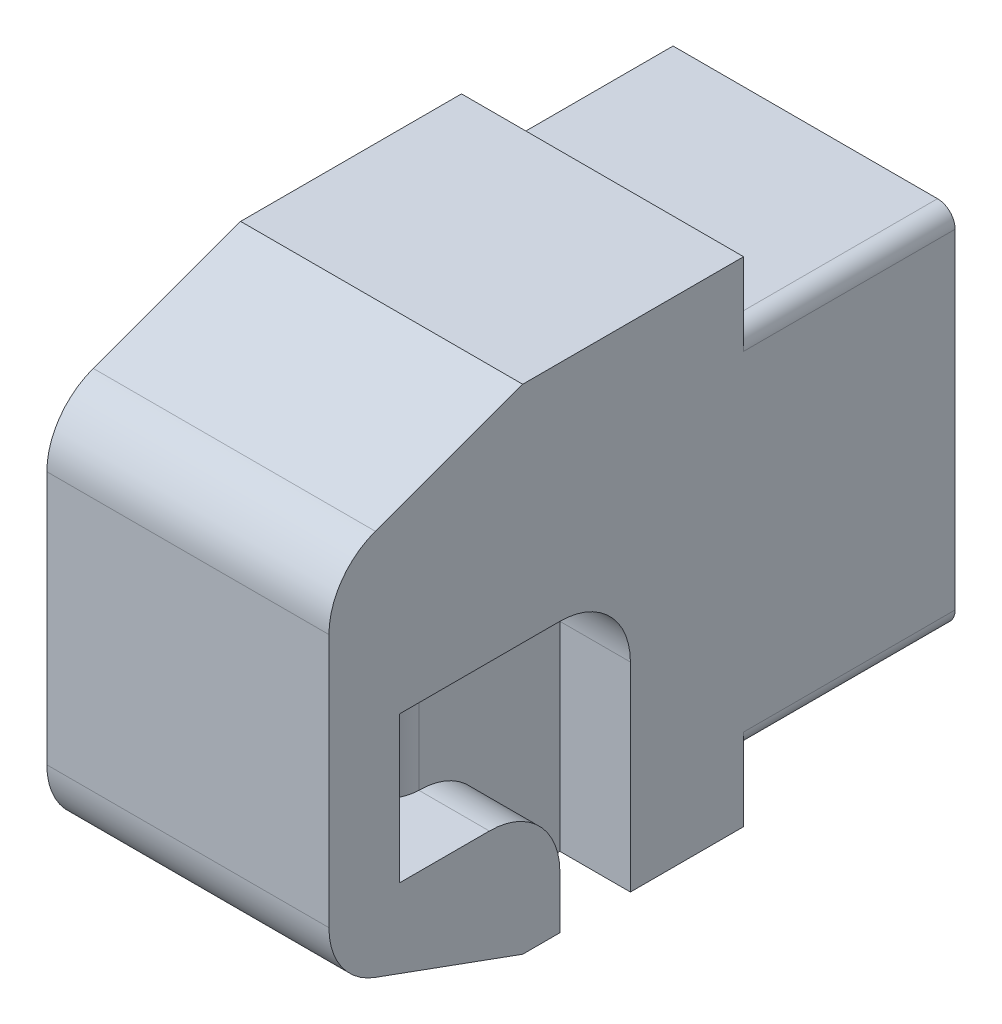
ISO-10303-21;
HEADER;
FILE_DESCRIPTION(('STEP AP214'),'2;1');
FILE_NAME('part.step','',(''),(''),'','','');
FILE_SCHEMA(('AUTOMOTIVE_DESIGN { 1 0 10303 214 1 1 1 1 }'));
ENDSEC;
DATA;
#1=APPLICATION_CONTEXT('core data for automotive mechanical design processes');
#2=APPLICATION_PROTOCOL_DEFINITION('international standard','automotive_design',2000,#1);
#3=PRODUCT_CONTEXT('',#1,'mechanical');
#4=PRODUCT('Part','Part','',(#3));
#5=PRODUCT_RELATED_PRODUCT_CATEGORY('part','',(#4));
#6=PRODUCT_DEFINITION_FORMATION('','',#4);
#7=PRODUCT_DEFINITION_CONTEXT('part definition',#1,'design');
#8=PRODUCT_DEFINITION('design','',#6,#7);
#9=PRODUCT_DEFINITION_SHAPE('','',#8);
#10=(LENGTH_UNIT() NAMED_UNIT(*) SI_UNIT(.MILLI.,.METRE.));
#11=(NAMED_UNIT(*) PLANE_ANGLE_UNIT() SI_UNIT($,.RADIAN.));
#12=(NAMED_UNIT(*) SI_UNIT($,.STERADIAN.) SOLID_ANGLE_UNIT());
#13=UNCERTAINTY_MEASURE_WITH_UNIT(LENGTH_MEASURE(1.E-05),#10,'distance_accuracy_value','');
#14=(GEOMETRIC_REPRESENTATION_CONTEXT(3) GLOBAL_UNCERTAINTY_ASSIGNED_CONTEXT((#13)) GLOBAL_UNIT_ASSIGNED_CONTEXT((#10,
#11,#12)) REPRESENTATION_CONTEXT('',''));
#15=CARTESIAN_POINT('',(0.,0.,0.));
#16=DIRECTION('',(0.,0.,1.));
#17=DIRECTION('',(1.,0.,0.));
#18=AXIS2_PLACEMENT_3D('',#15,#16,#17);
#19=CARTESIAN_POINT('',(0.,0.,6.));
#20=DIRECTION('',(1.,0.,0.));
#21=DIRECTION('',(0.,1.,0.));
#22=AXIS2_PLACEMENT_3D('',#19,#20,#21);
#23=PLANE('',#22);
#24=DIRECTION('',(0.,-1.,0.));
#25=VECTOR('',#24,1.);
#26=CARTESIAN_POINT('',(0.,-1.825,17.76));
#27=LINE('',#26,#25);
#28=CARTESIAN_POINT('',(0.,8.77458492358058,17.76));
#29=VERTEX_POINT('',#28);
#30=CARTESIAN_POINT('',(0.,1.57541507641942,17.76));
#31=VERTEX_POINT('',#30);
#32=EDGE_CURVE('E272',#29,#31,#27,.T.);
#33=ORIENTED_EDGE('',*,*,#32,.F.);
#34=CARTESIAN_POINT('',(0.,8.77458492358058,15.76));
#35=DIRECTION('',(1.,0.,0.));
#36=DIRECTION('',(0.,1.,0.));
#37=AXIS2_PLACEMENT_3D('',#34,#35,#36);
#38=CIRCLE('',#37,2.);
#39=CARTESIAN_POINT('',(0.,10.6539701651524,16.4440402866513));
#40=VERTEX_POINT('',#39);
#41=EDGE_CURVE('E340',#29,#40,#38,.F.);
#42=ORIENTED_EDGE('',*,*,#41,.T.);
#43=DIRECTION('',(0.,-0.342020143325669,0.939692620785908));
#44=VECTOR('',#43,1.);
#45=CARTESIAN_POINT('',(0.,10.175,17.76));
#46=LINE('',#45,#44);
#47=CARTESIAN_POINT('',(0.,12.175,12.2650451610908));
#48=VERTEX_POINT('',#47);
#49=EDGE_CURVE('E321',#40,#48,#46,.F.);
#50=ORIENTED_EDGE('',*,*,#49,.T.);
#51=DIRECTION('',(0.,0.,-1.));
#52=VECTOR('',#51,1.);
#53=CARTESIAN_POINT('',(0.,12.175,17.76));
#54=LINE('',#53,#52);
#55=CARTESIAN_POINT('',(0.,12.175,6.));
#56=VERTEX_POINT('',#55);
#57=EDGE_CURVE('E279',#48,#56,#54,.T.);
#58=ORIENTED_EDGE('',*,*,#57,.T.);
#59=DIRECTION('',(0.,-1.,0.));
#60=VECTOR('',#59,1.);
#61=CARTESIAN_POINT('',(0.,-1.825,6.));
#62=LINE('',#61,#60);
#63=CARTESIAN_POINT('',(0.,10.35,6.));
#64=VERTEX_POINT('',#63);
#65=EDGE_CURVE('E280',#56,#64,#62,.T.);
#66=ORIENTED_EDGE('',*,*,#65,.T.);
#67=DIRECTION('',(0.,0.,-1.));
#68=VECTOR('',#67,1.);
#69=CARTESIAN_POINT('',(0.,10.35,6.));
#70=LINE('',#69,#68);
#71=CARTESIAN_POINT('',(0.,10.35,0.));
#72=VERTEX_POINT('',#71);
#73=EDGE_CURVE('E304',#64,#72,#70,.T.);
#74=ORIENTED_EDGE('',*,*,#73,.T.);
#75=DIRECTION('',(0.,-1.,0.));
#76=VECTOR('',#75,1.);
#77=CARTESIAN_POINT('',(0.,0.,0.));
#78=LINE('',#77,#76);
#79=CARTESIAN_POINT('',(0.,0.,0.));
#80=VERTEX_POINT('',#79);
#81=EDGE_CURVE('E298',#72,#80,#78,.T.);
#82=ORIENTED_EDGE('',*,*,#81,.T.);
#83=DIRECTION('',(0.,0.,-1.));
#84=VECTOR('',#83,1.);
#85=CARTESIAN_POINT('',(0.,0.,6.));
#86=LINE('',#85,#84);
#87=CARTESIAN_POINT('',(0.,0.,6.));
#88=VERTEX_POINT('',#87);
#89=EDGE_CURVE('E315',#88,#80,#86,.T.);
#90=ORIENTED_EDGE('',*,*,#89,.F.);
#91=CARTESIAN_POINT('',(0.,-1.825,6.));
#92=VERTEX_POINT('',#91);
#93=EDGE_CURVE('E264',#88,#92,#62,.T.);
#94=ORIENTED_EDGE('',*,*,#93,.T.);
#95=DIRECTION('',(0.,0.,-1.));
#96=VECTOR('',#95,1.);
#97=CARTESIAN_POINT('',(0.,-1.825,17.76));
#98=LINE('',#97,#96);
#99=CARTESIAN_POINT('',(0.,-1.825,12.2650451610908));
#100=VERTEX_POINT('',#99);
#101=EDGE_CURVE('E296',#100,#92,#98,.T.);
#102=ORIENTED_EDGE('',*,*,#101,.F.);
#103=DIRECTION('',(0.,-0.342020143325669,-0.939692620785908));
#104=VECTOR('',#103,1.);
#105=CARTESIAN_POINT('',(0.,0.175000000000005,17.76));
#106=LINE('',#105,#104);
#107=CARTESIAN_POINT('',(0.,-0.303970165152393,16.4440402866513));
#108=VERTEX_POINT('',#107);
#109=EDGE_CURVE('E318',#100,#108,#106,.F.);
#110=ORIENTED_EDGE('',*,*,#109,.T.);
#111=CARTESIAN_POINT('',(0.,1.57541507641942,15.76));
#112=DIRECTION('',(1.,0.,0.));
#113=DIRECTION('',(0.,1.,0.));
#114=AXIS2_PLACEMENT_3D('',#111,#112,#113);
#115=CIRCLE('',#114,2.);
#116=EDGE_CURVE('E338',#108,#31,#115,.F.);
#117=ORIENTED_EDGE('',*,*,#116,.T.);
#118=EDGE_LOOP('',(#33,#42,#50,#58,#66,#74,#82,#90,#94,#102,#110,#117));
#119=FACE_BOUND('',#118,.T.);
#120=ADVANCED_FACE('F36',(#119),#23,.F.);
#121=CARTESIAN_POINT('',(0.,0.,6.));
#122=DIRECTION('',(0.,1.,0.));
#123=DIRECTION('',(0.,0.,1.));
#124=AXIS2_PLACEMENT_3D('',#121,#122,#123);
#125=PLANE('',#124);
#126=DIRECTION('',(1.,0.,0.));
#127=VECTOR('',#126,1.);
#128=CARTESIAN_POINT('',(0.,0.,0.));
#129=LINE('',#128,#127);
#130=CARTESIAN_POINT('',(7.5,0.,0.));
#131=VERTEX_POINT('',#130);
#132=EDGE_CURVE('E307',#80,#131,#129,.T.);
#133=ORIENTED_EDGE('',*,*,#132,.T.);
#134=DIRECTION('',(0.,0.,-1.));
#135=VECTOR('',#134,1.);
#136=CARTESIAN_POINT('',(7.5,0.,6.));
#137=LINE('',#136,#135);
#138=CARTESIAN_POINT('',(7.5,0.,6.));
#139=VERTEX_POINT('',#138);
#140=EDGE_CURVE('E51',#131,#139,#137,.F.);
#141=ORIENTED_EDGE('',*,*,#140,.T.);
#142=DIRECTION('',(1.,0.,0.));
#143=VECTOR('',#142,1.);
#144=CARTESIAN_POINT('',(0.,0.,6.));
#145=LINE('',#144,#143);
#146=EDGE_CURVE('E299',#88,#139,#145,.T.);
#147=ORIENTED_EDGE('',*,*,#146,.F.);
#148=ORIENTED_EDGE('',*,*,#89,.T.);
#149=EDGE_LOOP('',(#133,#141,#147,#148));
#150=FACE_BOUND('',#149,.T.);
#151=ADVANCED_FACE('F409',(#150),#125,.F.);
#152=CARTESIAN_POINT('',(8.,0.,6.));
#153=DIRECTION('',(-1.,0.,0.));
#154=DIRECTION('',(0.,-1.,0.));
#155=AXIS2_PLACEMENT_3D('',#152,#153,#154);
#156=PLANE('',#155);
#157=DIRECTION('',(0.,1.,0.));
#158=VECTOR('',#157,1.);
#159=CARTESIAN_POINT('',(8.,0.,0.));
#160=LINE('',#159,#158);
#161=CARTESIAN_POINT('',(8.,0.5,0.));
#162=VERTEX_POINT('',#161);
#163=CARTESIAN_POINT('',(8.,9.85,0.));
#164=VERTEX_POINT('',#163);
#165=EDGE_CURVE('E309',#162,#164,#160,.T.);
#166=ORIENTED_EDGE('',*,*,#165,.T.);
#167=DIRECTION('',(0.,0.,-1.));
#168=VECTOR('',#167,1.);
#169=CARTESIAN_POINT('',(8.,9.85,6.));
#170=LINE('',#169,#168);
#171=CARTESIAN_POINT('',(8.,9.85,6.));
#172=VERTEX_POINT('',#171);
#173=EDGE_CURVE('E385',#164,#172,#170,.F.);
#174=ORIENTED_EDGE('',*,*,#173,.T.);
#175=DIRECTION('',(0.,1.,0.));
#176=VECTOR('',#175,1.);
#177=CARTESIAN_POINT('',(8.,-1.825,6.));
#178=LINE('',#177,#176);
#179=CARTESIAN_POINT('',(8.,12.175,6.));
#180=VERTEX_POINT('',#179);
#181=EDGE_CURVE('E59',#172,#180,#178,.T.);
#182=ORIENTED_EDGE('',*,*,#181,.T.);
#183=DIRECTION('',(0.,0.,-1.));
#184=VECTOR('',#183,1.);
#185=CARTESIAN_POINT('',(8.,12.175,17.76));
#186=LINE('',#185,#184);
#187=CARTESIAN_POINT('',(8.,12.175,12.2650451610908));
#188=VERTEX_POINT('',#187);
#189=EDGE_CURVE('E291',#188,#180,#186,.T.);
#190=ORIENTED_EDGE('',*,*,#189,.F.);
#191=DIRECTION('',(0.,0.342020143325669,-0.939692620785908));
#192=VECTOR('',#191,1.);
#193=CARTESIAN_POINT('',(8.,10.175,17.76));
#194=LINE('',#193,#192);
#195=CARTESIAN_POINT('',(8.,10.6539701651524,16.4440402866513));
#196=VERTEX_POINT('',#195);
#197=EDGE_CURVE('E327',#188,#196,#194,.F.);
#198=ORIENTED_EDGE('',*,*,#197,.T.);
#199=CARTESIAN_POINT('',(8.,8.77458492358058,15.76));
#200=DIRECTION('',(-1.,0.,0.));
#201=DIRECTION('',(0.,-1.,0.));
#202=AXIS2_PLACEMENT_3D('',#199,#200,#201);
#203=CIRCLE('',#202,2.);
#204=CARTESIAN_POINT('',(8.,8.77458492358057,17.76));
#205=VERTEX_POINT('',#204);
#206=EDGE_CURVE('E346',#196,#205,#203,.F.);
#207=ORIENTED_EDGE('',*,*,#206,.T.);
#208=DIRECTION('',(0.,1.,0.));
#209=VECTOR('',#208,1.);
#210=CARTESIAN_POINT('',(8.,-1.825,17.76));
#211=LINE('',#210,#209);
#212=CARTESIAN_POINT('',(8.,1.57541507641942,17.76));
#213=VERTEX_POINT('',#212);
#214=EDGE_CURVE('E275',#213,#205,#211,.T.);
#215=ORIENTED_EDGE('',*,*,#214,.F.);
#216=CARTESIAN_POINT('',(8.,1.57541507641942,15.76));
#217=DIRECTION('',(-1.,0.,0.));
#218=DIRECTION('',(0.,-1.,0.));
#219=AXIS2_PLACEMENT_3D('',#216,#217,#218);
#220=CIRCLE('',#219,2.);
#221=CARTESIAN_POINT('',(8.,-0.303970165152394,16.4440402866513));
#222=VERTEX_POINT('',#221);
#223=EDGE_CURVE('E344',#213,#222,#220,.F.);
#224=ORIENTED_EDGE('',*,*,#223,.T.);
#225=DIRECTION('',(0.,0.342020143325669,0.939692620785908));
#226=VECTOR('',#225,1.);
#227=CARTESIAN_POINT('',(8.,0.175000000000005,17.76));
#228=LINE('',#227,#226);
#229=CARTESIAN_POINT('',(8.,-1.825,12.2650451610908));
#230=VERTEX_POINT('',#229);
#231=EDGE_CURVE('E325',#222,#230,#228,.F.);
#232=ORIENTED_EDGE('',*,*,#231,.T.);
#233=DIRECTION('',(0.,0.,-1.));
#234=VECTOR('',#233,1.);
#235=CARTESIAN_POINT('',(8.,-1.825,17.76));
#236=LINE('',#235,#234);
#237=CARTESIAN_POINT('',(8.,-1.825,11.21));
#238=VERTEX_POINT('',#237);
#239=EDGE_CURVE('E294',#230,#238,#236,.T.);
#240=ORIENTED_EDGE('',*,*,#239,.T.);
#241=DIRECTION('',(0.,-1.,0.));
#242=VECTOR('',#241,1.);
#243=CARTESIAN_POINT('',(8.,-1.825,11.21));
#244=LINE('',#243,#242);
#245=CARTESIAN_POINT('',(8.,-0.324999999999999,11.21));
#246=VERTEX_POINT('',#245);
#247=EDGE_CURVE('E222',#246,#238,#244,.T.);
#248=ORIENTED_EDGE('',*,*,#247,.F.);
#249=CARTESIAN_POINT('',(8.,-0.324999999999999,13.21));
#250=DIRECTION('',(-1.,0.,0.));
#251=DIRECTION('',(0.,-1.,0.));
#252=AXIS2_PLACEMENT_3D('',#249,#250,#251);
#253=CIRCLE('',#252,2.);
#254=CARTESIAN_POINT('',(8.,1.675,13.21));
#255=VERTEX_POINT('',#254);
#256=EDGE_CURVE('E359',#246,#255,#253,.F.);
#257=ORIENTED_EDGE('',*,*,#256,.T.);
#258=DIRECTION('',(0.,0.,-1.));
#259=VECTOR('',#258,1.);
#260=CARTESIAN_POINT('',(8.,1.675,14.21));
#261=LINE('',#260,#259);
#262=CARTESIAN_POINT('',(8.,1.675,15.76));
#263=VERTEX_POINT('',#262);
#264=EDGE_CURVE('E245',#263,#255,#261,.T.);
#265=ORIENTED_EDGE('',*,*,#264,.F.);
#266=DIRECTION('',(0.,-1.,0.));
#267=VECTOR('',#266,1.);
#268=CARTESIAN_POINT('',(8.,1.675,15.76));
#269=LINE('',#268,#267);
#270=CARTESIAN_POINT('',(8.,5.825,15.76));
#271=VERTEX_POINT('',#270);
#272=EDGE_CURVE('E256',#271,#263,#269,.T.);
#273=ORIENTED_EDGE('',*,*,#272,.F.);
#274=DIRECTION('',(0.,0.,1.));
#275=VECTOR('',#274,1.);
#276=CARTESIAN_POINT('',(8.,5.825,14.21));
#277=LINE('',#276,#275);
#278=CARTESIAN_POINT('',(8.,5.82500000000001,11.21));
#279=VERTEX_POINT('',#278);
#280=EDGE_CURVE('E239',#279,#271,#277,.T.);
#281=ORIENTED_EDGE('',*,*,#280,.F.);
#282=CARTESIAN_POINT('',(8.,3.82500000000001,11.21));
#283=DIRECTION('',(-1.,0.,0.));
#284=DIRECTION('',(0.,-1.,0.));
#285=AXIS2_PLACEMENT_3D('',#282,#283,#284);
#286=CIRCLE('',#285,2.);
#287=CARTESIAN_POINT('',(8.,3.82500000000001,9.20999999999999));
#288=VERTEX_POINT('',#287);
#289=EDGE_CURVE('E364',#279,#288,#286,.T.);
#290=ORIENTED_EDGE('',*,*,#289,.T.);
#291=DIRECTION('',(0.,1.,0.));
#292=VECTOR('',#291,1.);
#293=CARTESIAN_POINT('',(8.,-1.825,9.20999999999999));
#294=LINE('',#293,#292);
#295=CARTESIAN_POINT('',(8.,-1.825,9.20999999999999));
#296=VERTEX_POINT('',#295);
#297=EDGE_CURVE('E216',#296,#288,#294,.T.);
#298=ORIENTED_EDGE('',*,*,#297,.F.);
#299=CARTESIAN_POINT('',(8.,-1.825,6.));
#300=VERTEX_POINT('',#299);
#301=EDGE_CURVE('E293',#296,#300,#236,.T.);
#302=ORIENTED_EDGE('',*,*,#301,.T.);
#303=CARTESIAN_POINT('',(8.,0.499999999999999,6.));
#304=VERTEX_POINT('',#303);
#305=EDGE_CURVE('E286',#300,#304,#178,.T.);
#306=ORIENTED_EDGE('',*,*,#305,.T.);
#307=DIRECTION('',(0.,0.,-1.));
#308=VECTOR('',#307,1.);
#309=CARTESIAN_POINT('',(8.,0.5,6.));
#310=LINE('',#309,#308);
#311=EDGE_CURVE('E382',#304,#162,#310,.T.);
#312=ORIENTED_EDGE('',*,*,#311,.T.);
#313=EDGE_LOOP('',(#166,#174,#182,#190,#198,#207,#215,#224,#232,#240,#248,#257,#265,#273,#281,
#290,#298,#302,#306,#312));
#314=FACE_BOUND('',#313,.T.);
#315=ADVANCED_FACE('F404',(#314),#156,.F.);
#316=CARTESIAN_POINT('',(0.,10.35,6.));
#317=DIRECTION('',(0.,-1.,0.));
#318=DIRECTION('',(0.,0.,-1.));
#319=AXIS2_PLACEMENT_3D('',#316,#317,#318);
#320=PLANE('',#319);
#321=DIRECTION('',(-1.,0.,0.));
#322=VECTOR('',#321,1.);
#323=CARTESIAN_POINT('',(0.,10.35,6.));
#324=LINE('',#323,#322);
#325=CARTESIAN_POINT('',(7.5,10.35,6.));
#326=VERTEX_POINT('',#325);
#327=EDGE_CURVE('E301',#326,#64,#324,.T.);
#328=ORIENTED_EDGE('',*,*,#327,.F.);
#329=DIRECTION('',(0.,0.,-1.));
#330=VECTOR('',#329,1.);
#331=CARTESIAN_POINT('',(7.5,10.35,6.));
#332=LINE('',#331,#330);
#333=CARTESIAN_POINT('',(7.5,10.35,0.));
#334=VERTEX_POINT('',#333);
#335=EDGE_CURVE('E375',#326,#334,#332,.T.);
#336=ORIENTED_EDGE('',*,*,#335,.T.);
#337=DIRECTION('',(-1.,0.,0.));
#338=VECTOR('',#337,1.);
#339=CARTESIAN_POINT('',(0.,10.35,0.));
#340=LINE('',#339,#338);
#341=EDGE_CURVE('E302',#334,#72,#340,.T.);
#342=ORIENTED_EDGE('',*,*,#341,.T.);
#343=ORIENTED_EDGE('',*,*,#73,.F.);
#344=EDGE_LOOP('',(#328,#336,#342,#343));
#345=FACE_BOUND('',#344,.T.);
#346=ADVANCED_FACE('F396',(#345),#320,.F.);
#347=CARTESIAN_POINT('',(0.,0.,0.));
#348=DIRECTION('',(0.,0.,-1.));
#349=DIRECTION('',(-1.,0.,0.));
#350=AXIS2_PLACEMENT_3D('',#347,#348,#349);
#351=PLANE('',#350);
#352=ORIENTED_EDGE('',*,*,#341,.F.);
#353=CARTESIAN_POINT('',(7.5,9.85,0.));
#354=DIRECTION('',(0.,0.,-1.));
#355=DIRECTION('',(-1.,0.,0.));
#356=AXIS2_PLACEMENT_3D('',#353,#354,#355);
#357=CIRCLE('',#356,0.5);
#358=EDGE_CURVE('E380',#334,#164,#357,.T.);
#359=ORIENTED_EDGE('',*,*,#358,.T.);
#360=ORIENTED_EDGE('',*,*,#165,.F.);
#361=CARTESIAN_POINT('',(7.5,0.5,0.));
#362=DIRECTION('',(0.,0.,-1.));
#363=DIRECTION('',(-1.,0.,0.));
#364=AXIS2_PLACEMENT_3D('',#361,#362,#363);
#365=CIRCLE('',#364,0.5);
#366=EDGE_CURVE('E378',#162,#131,#365,.T.);
#367=ORIENTED_EDGE('',*,*,#366,.T.);
#368=ORIENTED_EDGE('',*,*,#132,.F.);
#369=ORIENTED_EDGE('',*,*,#81,.F.);
#370=EDGE_LOOP('',(#352,#359,#360,#367,#368,#369));
#371=FACE_BOUND('',#370,.T.);
#372=ADVANCED_FACE('F401',(#371),#351,.T.);
#373=CARTESIAN_POINT('',(0.,0.,6.));
#374=DIRECTION('',(0.,0.,-1.));
#375=DIRECTION('',(-1.,0.,0.));
#376=AXIS2_PLACEMENT_3D('',#373,#374,#375);
#377=PLANE('',#376);
#378=ORIENTED_EDGE('',*,*,#93,.F.);
#379=ORIENTED_EDGE('',*,*,#146,.T.);
#380=CARTESIAN_POINT('',(7.5,0.5,6.));
#381=DIRECTION('',(0.,0.,-1.));
#382=DIRECTION('',(-1.,0.,0.));
#383=AXIS2_PLACEMENT_3D('',#380,#381,#382);
#384=CIRCLE('',#383,0.5);
#385=EDGE_CURVE('E11',#139,#304,#384,.F.);
#386=ORIENTED_EDGE('',*,*,#385,.T.);
#387=ORIENTED_EDGE('',*,*,#305,.F.);
#388=DIRECTION('',(1.,0.,0.));
#389=VECTOR('',#388,1.);
#390=CARTESIAN_POINT('',(0.,-1.825,6.));
#391=LINE('',#390,#389);
#392=EDGE_CURVE('E283',#92,#300,#391,.T.);
#393=ORIENTED_EDGE('',*,*,#392,.F.);
#394=EDGE_LOOP('',(#378,#379,#386,#387,#393));
#395=FACE_BOUND('',#394,.T.);
#396=ADVANCED_FACE('F445',(#395),#377,.T.);
#397=CARTESIAN_POINT('',(0.,-1.825,17.76));
#398=DIRECTION('',(0.,1.,0.));
#399=DIRECTION('',(-1.,0.,0.));
#400=AXIS2_PLACEMENT_3D('',#397,#398,#399);
#401=PLANE('',#400);
#402=ORIENTED_EDGE('',*,*,#239,.F.);
#403=DIRECTION('',(-1.,0.,0.));
#404=VECTOR('',#403,1.);
#405=CARTESIAN_POINT('',(0.,-1.825,12.2650451610908));
#406=LINE('',#405,#404);
#407=EDGE_CURVE('E330',#230,#100,#406,.T.);
#408=ORIENTED_EDGE('',*,*,#407,.T.);
#409=ORIENTED_EDGE('',*,*,#101,.T.);
#410=ORIENTED_EDGE('',*,*,#392,.T.);
#411=ORIENTED_EDGE('',*,*,#301,.F.);
#412=DIRECTION('',(1.,0.,0.));
#413=VECTOR('',#412,1.);
#414=CARTESIAN_POINT('',(6.,-1.825,9.20999999999999));
#415=LINE('',#414,#413);
#416=CARTESIAN_POINT('',(6.,-1.825,9.20999999999999));
#417=VERTEX_POINT('',#416);
#418=EDGE_CURVE('E226',#417,#296,#415,.T.);
#419=ORIENTED_EDGE('',*,*,#418,.F.);
#420=DIRECTION('',(0.,0.,-1.));
#421=VECTOR('',#420,1.);
#422=CARTESIAN_POINT('',(6.,-1.825,9.20999999999999));
#423=LINE('',#422,#421);
#424=CARTESIAN_POINT('',(6.,-1.825,11.21));
#425=VERTEX_POINT('',#424);
#426=EDGE_CURVE('E208',#425,#417,#423,.T.);
#427=ORIENTED_EDGE('',*,*,#426,.F.);
#428=DIRECTION('',(1.,0.,0.));
#429=VECTOR('',#428,1.);
#430=CARTESIAN_POINT('',(6.,-1.825,11.21));
#431=LINE('',#430,#429);
#432=EDGE_CURVE('E219',#425,#238,#431,.T.);
#433=ORIENTED_EDGE('',*,*,#432,.T.);
#434=EDGE_LOOP('',(#402,#408,#409,#410,#411,#419,#427,#433));
#435=FACE_BOUND('',#434,.T.);
#436=ADVANCED_FACE('F229',(#435),#401,.F.);
#437=CARTESIAN_POINT('',(0.,12.175,17.76));
#438=DIRECTION('',(0.,-1.,0.));
#439=DIRECTION('',(1.,0.,0.));
#440=AXIS2_PLACEMENT_3D('',#437,#438,#439);
#441=PLANE('',#440);
#442=ORIENTED_EDGE('',*,*,#57,.F.);
#443=DIRECTION('',(1.,0.,0.));
#444=VECTOR('',#443,1.);
#445=CARTESIAN_POINT('',(0.,12.175,12.2650451610908));
#446=LINE('',#445,#444);
#447=EDGE_CURVE('E323',#48,#188,#446,.T.);
#448=ORIENTED_EDGE('',*,*,#447,.T.);
#449=ORIENTED_EDGE('',*,*,#189,.T.);
#450=DIRECTION('',(-1.,0.,0.));
#451=VECTOR('',#450,1.);
#452=CARTESIAN_POINT('',(0.,12.175,6.));
#453=LINE('',#452,#451);
#454=EDGE_CURVE('E276',#180,#56,#453,.T.);
#455=ORIENTED_EDGE('',*,*,#454,.T.);
#456=EDGE_LOOP('',(#442,#448,#449,#455));
#457=FACE_BOUND('',#456,.T.);
#458=ADVANCED_FACE('F417',(#457),#441,.F.);
#459=CARTESIAN_POINT('',(0.,0.,17.76));
#460=DIRECTION('',(0.,0.,-1.));
#461=DIRECTION('',(-1.,0.,0.));
#462=AXIS2_PLACEMENT_3D('',#459,#460,#461);
#463=PLANE('',#462);
#464=ORIENTED_EDGE('',*,*,#214,.T.);
#465=DIRECTION('',(1.,0.,0.));
#466=VECTOR('',#465,1.);
#467=CARTESIAN_POINT('',(0.,8.77458492358058,17.76));
#468=LINE('',#467,#466);
#469=EDGE_CURVE('E335',#205,#29,#468,.F.);
#470=ORIENTED_EDGE('',*,*,#469,.T.);
#471=ORIENTED_EDGE('',*,*,#32,.T.);
#472=DIRECTION('',(-1.,0.,0.));
#473=VECTOR('',#472,1.);
#474=CARTESIAN_POINT('',(8.,1.57541507641942,17.76));
#475=LINE('',#474,#473);
#476=EDGE_CURVE('E332',#31,#213,#475,.F.);
#477=ORIENTED_EDGE('',*,*,#476,.T.);
#478=EDGE_LOOP('',(#464,#470,#471,#477));
#479=FACE_BOUND('',#478,.T.);
#480=ADVANCED_FACE('F431',(#479),#463,.F.);
#481=ORIENTED_EDGE('',*,*,#181,.F.);
#482=CARTESIAN_POINT('',(7.5,9.85,6.));
#483=DIRECTION('',(0.,0.,-1.));
#484=DIRECTION('',(-1.,0.,0.));
#485=AXIS2_PLACEMENT_3D('',#482,#483,#484);
#486=CIRCLE('',#485,0.5);
#487=EDGE_CURVE('E44',#172,#326,#486,.F.);
#488=ORIENTED_EDGE('',*,*,#487,.T.);
#489=ORIENTED_EDGE('',*,*,#327,.T.);
#490=ORIENTED_EDGE('',*,*,#65,.F.);
#491=ORIENTED_EDGE('',*,*,#454,.F.);
#492=EDGE_LOOP('',(#481,#488,#489,#490,#491));
#493=FACE_BOUND('',#492,.T.);
#494=ADVANCED_FACE('F389',(#493),#377,.T.);
#495=CARTESIAN_POINT('',(2.,1.675,14.21));
#496=DIRECTION('',(0.,0.,-1.));
#497=DIRECTION('',(-1.,0.,0.));
#498=AXIS2_PLACEMENT_3D('',#495,#496,#497);
#499=PLANE('',#498);
#500=DIRECTION('',(1.,0.,0.));
#501=VECTOR('',#500,1.);
#502=CARTESIAN_POINT('',(2.,1.675,14.21));
#503=LINE('',#502,#501);
#504=CARTESIAN_POINT('',(2.,1.675,14.21));
#505=VERTEX_POINT('',#504);
#506=CARTESIAN_POINT('',(5.,1.675,14.21));
#507=VERTEX_POINT('',#506);
#508=EDGE_CURVE('E261',#505,#507,#503,.T.);
#509=ORIENTED_EDGE('',*,*,#508,.T.);
#510=DIRECTION('',(0.,-1.,0.));
#511=VECTOR('',#510,1.);
#512=CARTESIAN_POINT('',(5.,1.675,14.21));
#513=LINE('',#512,#511);
#514=CARTESIAN_POINT('',(5.,5.825,14.21));
#515=VERTEX_POINT('',#514);
#516=EDGE_CURVE('E369',#507,#515,#513,.F.);
#517=ORIENTED_EDGE('',*,*,#516,.T.);
#518=DIRECTION('',(1.,0.,0.));
#519=VECTOR('',#518,1.);
#520=CARTESIAN_POINT('',(2.,5.825,14.21));
#521=LINE('',#520,#519);
#522=CARTESIAN_POINT('',(2.,5.825,14.21));
#523=VERTEX_POINT('',#522);
#524=EDGE_CURVE('E254',#523,#515,#521,.T.);
#525=ORIENTED_EDGE('',*,*,#524,.F.);
#526=DIRECTION('',(0.,1.,0.));
#527=VECTOR('',#526,1.);
#528=CARTESIAN_POINT('',(2.,1.675,14.21));
#529=LINE('',#528,#527);
#530=EDGE_CURVE('E241',#505,#523,#529,.T.);
#531=ORIENTED_EDGE('',*,*,#530,.F.);
#532=EDGE_LOOP('',(#509,#517,#525,#531));
#533=FACE_BOUND('',#532,.T.);
#534=ADVANCED_FACE('F479',(#533),#499,.F.);
#535=CARTESIAN_POINT('',(2.,1.675,14.21));
#536=DIRECTION('',(0.,-1.,0.));
#537=DIRECTION('',(0.,0.,-1.));
#538=AXIS2_PLACEMENT_3D('',#535,#536,#537);
#539=PLANE('',#538);
#540=ORIENTED_EDGE('',*,*,#264,.T.);
#541=DIRECTION('',(1.,0.,0.));
#542=VECTOR('',#541,1.);
#543=CARTESIAN_POINT('',(2.,1.675,13.21));
#544=LINE('',#543,#542);
#545=CARTESIAN_POINT('',(6.,1.675,13.21));
#546=VERTEX_POINT('',#545);
#547=EDGE_CURVE('E361',#255,#546,#544,.F.);
#548=ORIENTED_EDGE('',*,*,#547,.T.);
#549=CARTESIAN_POINT('',(5.,1.675,13.21));
#550=DIRECTION('',(0.,-1.,0.));
#551=DIRECTION('',(0.,0.,-1.));
#552=AXIS2_PLACEMENT_3D('',#549,#550,#551);
#553=CIRCLE('',#552,1.);
#554=EDGE_CURVE('E371',#546,#507,#553,.T.);
#555=ORIENTED_EDGE('',*,*,#554,.T.);
#556=ORIENTED_EDGE('',*,*,#508,.F.);
#557=DIRECTION('',(0.,0.,-1.));
#558=VECTOR('',#557,1.);
#559=CARTESIAN_POINT('',(2.,1.675,14.21));
#560=LINE('',#559,#558);
#561=CARTESIAN_POINT('',(2.,1.675,15.76));
#562=VERTEX_POINT('',#561);
#563=EDGE_CURVE('E251',#562,#505,#560,.T.);
#564=ORIENTED_EDGE('',*,*,#563,.F.);
#565=DIRECTION('',(1.,0.,0.));
#566=VECTOR('',#565,1.);
#567=CARTESIAN_POINT('',(2.,1.675,15.76));
#568=LINE('',#567,#566);
#569=EDGE_CURVE('E265',#562,#263,#568,.T.);
#570=ORIENTED_EDGE('',*,*,#569,.T.);
#571=EDGE_LOOP('',(#540,#548,#555,#556,#564,#570));
#572=FACE_BOUND('',#571,.T.);
#573=ADVANCED_FACE('F466',(#572),#539,.F.);
#574=CARTESIAN_POINT('',(2.,1.675,15.76));
#575=DIRECTION('',(0.,0.,1.));
#576=DIRECTION('',(0.,-1.,0.));
#577=AXIS2_PLACEMENT_3D('',#574,#575,#576);
#578=PLANE('',#577);
#579=ORIENTED_EDGE('',*,*,#272,.T.);
#580=ORIENTED_EDGE('',*,*,#569,.F.);
#581=DIRECTION('',(0.,-1.,0.));
#582=VECTOR('',#581,1.);
#583=CARTESIAN_POINT('',(2.,1.675,15.76));
#584=LINE('',#583,#582);
#585=CARTESIAN_POINT('',(2.,5.825,15.76));
#586=VERTEX_POINT('',#585);
#587=EDGE_CURVE('E248',#586,#562,#584,.T.);
#588=ORIENTED_EDGE('',*,*,#587,.F.);
#589=DIRECTION('',(1.,0.,0.));
#590=VECTOR('',#589,1.);
#591=CARTESIAN_POINT('',(2.,5.825,15.76));
#592=LINE('',#591,#590);
#593=EDGE_CURVE('E267',#586,#271,#592,.T.);
#594=ORIENTED_EDGE('',*,*,#593,.T.);
#595=EDGE_LOOP('',(#579,#580,#588,#594));
#596=FACE_BOUND('',#595,.T.);
#597=ADVANCED_FACE('F472',(#596),#578,.F.);
#598=CARTESIAN_POINT('',(2.,5.825,14.21));
#599=DIRECTION('',(0.,1.,0.));
#600=DIRECTION('',(0.,0.,1.));
#601=AXIS2_PLACEMENT_3D('',#598,#599,#600);
#602=PLANE('',#601);
#603=DIRECTION('',(0.,0.,1.));
#604=VECTOR('',#603,1.);
#605=CARTESIAN_POINT('',(6.,5.825,14.21));
#606=LINE('',#605,#604);
#607=CARTESIAN_POINT('',(6.,5.825,11.21));
#608=VERTEX_POINT('',#607);
#609=CARTESIAN_POINT('',(6.,5.825,13.21));
#610=VERTEX_POINT('',#609);
#611=EDGE_CURVE('E227',#608,#610,#606,.T.);
#612=ORIENTED_EDGE('',*,*,#611,.F.);
#613=DIRECTION('',(1.,0.,0.));
#614=VECTOR('',#613,1.);
#615=CARTESIAN_POINT('',(8.,5.82500000000001,11.21));
#616=LINE('',#615,#614);
#617=EDGE_CURVE('E350',#608,#279,#616,.T.);
#618=ORIENTED_EDGE('',*,*,#617,.T.);
#619=ORIENTED_EDGE('',*,*,#280,.T.);
#620=ORIENTED_EDGE('',*,*,#593,.F.);
#621=DIRECTION('',(0.,0.,1.));
#622=VECTOR('',#621,1.);
#623=CARTESIAN_POINT('',(2.,5.825,14.21));
#624=LINE('',#623,#622);
#625=EDGE_CURVE('E244',#523,#586,#624,.T.);
#626=ORIENTED_EDGE('',*,*,#625,.F.);
#627=ORIENTED_EDGE('',*,*,#524,.T.);
#628=CARTESIAN_POINT('',(5.,5.825,13.21));
#629=DIRECTION('',(0.,1.,0.));
#630=DIRECTION('',(0.,0.,1.));
#631=AXIS2_PLACEMENT_3D('',#628,#629,#630);
#632=CIRCLE('',#631,1.);
#633=EDGE_CURVE('E373',#515,#610,#632,.T.);
#634=ORIENTED_EDGE('',*,*,#633,.T.);
#635=EDGE_LOOP('',(#612,#618,#619,#620,#626,#627,#634));
#636=FACE_BOUND('',#635,.T.);
#637=ADVANCED_FACE('F458',(#636),#602,.F.);
#638=CARTESIAN_POINT('',(2.,0.,0.));
#639=DIRECTION('',(1.,0.,0.));
#640=DIRECTION('',(0.,0.,-1.));
#641=AXIS2_PLACEMENT_3D('',#638,#639,#640);
#642=PLANE('',#641);
#643=ORIENTED_EDGE('',*,*,#530,.T.);
#644=ORIENTED_EDGE('',*,*,#625,.T.);
#645=ORIENTED_EDGE('',*,*,#587,.T.);
#646=ORIENTED_EDGE('',*,*,#563,.T.);
#647=EDGE_LOOP('',(#643,#644,#645,#646));
#648=FACE_BOUND('',#647,.T.);
#649=ADVANCED_FACE('F476',(#648),#642,.T.);
#650=CARTESIAN_POINT('',(6.,-1.825,9.20999999999999));
#651=DIRECTION('',(0.,0.,-1.));
#652=DIRECTION('',(-1.,0.,0.));
#653=AXIS2_PLACEMENT_3D('',#650,#651,#652);
#654=PLANE('',#653);
#655=ORIENTED_EDGE('',*,*,#297,.T.);
#656=DIRECTION('',(1.,0.,0.));
#657=VECTOR('',#656,1.);
#658=CARTESIAN_POINT('',(6.,3.82500000000001,9.20999999999999));
#659=LINE('',#658,#657);
#660=CARTESIAN_POINT('',(6.,3.82500000000001,9.20999999999999));
#661=VERTEX_POINT('',#660);
#662=EDGE_CURVE('E353',#288,#661,#659,.F.);
#663=ORIENTED_EDGE('',*,*,#662,.T.);
#664=DIRECTION('',(0.,1.,0.));
#665=VECTOR('',#664,1.);
#666=CARTESIAN_POINT('',(6.,-1.825,9.20999999999999));
#667=LINE('',#666,#665);
#668=EDGE_CURVE('E231',#417,#661,#667,.T.);
#669=ORIENTED_EDGE('',*,*,#668,.F.);
#670=ORIENTED_EDGE('',*,*,#418,.T.);
#671=EDGE_LOOP('',(#655,#663,#669,#670));
#672=FACE_BOUND('',#671,.T.);
#673=ADVANCED_FACE('F450',(#672),#654,.F.);
#674=CARTESIAN_POINT('',(6.,-1.825,11.21));
#675=DIRECTION('',(0.,0.,1.));
#676=DIRECTION('',(1.,0.,0.));
#677=AXIS2_PLACEMENT_3D('',#674,#675,#676);
#678=PLANE('',#677);
#679=DIRECTION('',(0.,-1.,0.));
#680=VECTOR('',#679,1.);
#681=CARTESIAN_POINT('',(6.,-1.825,11.21));
#682=LINE('',#681,#680);
#683=CARTESIAN_POINT('',(6.,-0.324999999999999,11.21));
#684=VERTEX_POINT('',#683);
#685=EDGE_CURVE('E202',#684,#425,#682,.T.);
#686=ORIENTED_EDGE('',*,*,#685,.F.);
#687=DIRECTION('',(1.,0.,0.));
#688=VECTOR('',#687,1.);
#689=CARTESIAN_POINT('',(6.,-0.324999999999999,11.21));
#690=LINE('',#689,#688);
#691=EDGE_CURVE('E357',#684,#246,#690,.T.);
#692=ORIENTED_EDGE('',*,*,#691,.T.);
#693=ORIENTED_EDGE('',*,*,#247,.T.);
#694=ORIENTED_EDGE('',*,*,#432,.F.);
#695=EDGE_LOOP('',(#686,#692,#693,#694));
#696=FACE_BOUND('',#695,.T.);
#697=ADVANCED_FACE('F220',(#696),#678,.F.);
#698=CARTESIAN_POINT('',(6.,0.,0.));
#699=DIRECTION('',(-1.,0.,0.));
#700=DIRECTION('',(0.,0.,1.));
#701=AXIS2_PLACEMENT_3D('',#698,#699,#700);
#702=PLANE('',#701);
#703=ORIENTED_EDGE('',*,*,#611,.T.);
#704=DIRECTION('',(0.,-1.,0.));
#705=VECTOR('',#704,1.);
#706=CARTESIAN_POINT('',(6.,0.,13.21));
#707=LINE('',#706,#705);
#708=EDGE_CURVE('E367',#610,#546,#707,.T.);
#709=ORIENTED_EDGE('',*,*,#708,.T.);
#710=CARTESIAN_POINT('',(6.,-0.324999999999999,13.21));
#711=DIRECTION('',(-1.,0.,0.));
#712=DIRECTION('',(0.,0.,1.));
#713=AXIS2_PLACEMENT_3D('',#710,#711,#712);
#714=CIRCLE('',#713,2.);
#715=EDGE_CURVE('E212',#546,#684,#714,.T.);
#716=ORIENTED_EDGE('',*,*,#715,.T.);
#717=ORIENTED_EDGE('',*,*,#685,.T.);
#718=ORIENTED_EDGE('',*,*,#426,.T.);
#719=ORIENTED_EDGE('',*,*,#668,.T.);
#720=CARTESIAN_POINT('',(6.,3.82500000000001,11.21));
#721=DIRECTION('',(-1.,0.,0.));
#722=DIRECTION('',(0.,0.,1.));
#723=AXIS2_PLACEMENT_3D('',#720,#721,#722);
#724=CIRCLE('',#723,2.);
#725=EDGE_CURVE('E355',#661,#608,#724,.F.);
#726=ORIENTED_EDGE('',*,*,#725,.T.);
#727=EDGE_LOOP('',(#703,#709,#716,#717,#718,#719,#726));
#728=FACE_BOUND('',#727,.T.);
#729=ADVANCED_FACE('F205',(#728),#702,.F.);
#730=CARTESIAN_POINT('',(0.,10.175,17.76));
#731=DIRECTION('',(0.,-0.939692620785908,-0.342020143325669));
#732=DIRECTION('',(-1.,0.,0.));
#733=AXIS2_PLACEMENT_3D('',#730,#731,#732);
#734=PLANE('',#733);
#735=ORIENTED_EDGE('',*,*,#49,.F.);
#736=DIRECTION('',(-1.,0.,0.));
#737=VECTOR('',#736,1.);
#738=CARTESIAN_POINT('',(8.,10.6539701651524,16.4440402866513));
#739=LINE('',#738,#737);
#740=EDGE_CURVE('E342',#40,#196,#739,.F.);
#741=ORIENTED_EDGE('',*,*,#740,.T.);
#742=ORIENTED_EDGE('',*,*,#197,.F.);
#743=ORIENTED_EDGE('',*,*,#447,.F.);
#744=EDGE_LOOP('',(#735,#741,#742,#743));
#745=FACE_BOUND('',#744,.T.);
#746=ADVANCED_FACE('F424',(#745),#734,.F.);
#747=CARTESIAN_POINT('',(0.,0.175000000000005,17.76));
#748=DIRECTION('',(0.,0.939692620785908,-0.342020143325669));
#749=DIRECTION('',(1.,0.,0.));
#750=AXIS2_PLACEMENT_3D('',#747,#748,#749);
#751=PLANE('',#750);
#752=ORIENTED_EDGE('',*,*,#231,.F.);
#753=DIRECTION('',(1.,0.,0.));
#754=VECTOR('',#753,1.);
#755=CARTESIAN_POINT('',(0.,-0.303970165152393,16.4440402866513));
#756=LINE('',#755,#754);
#757=EDGE_CURVE('E348',#222,#108,#756,.F.);
#758=ORIENTED_EDGE('',*,*,#757,.T.);
#759=ORIENTED_EDGE('',*,*,#109,.F.);
#760=ORIENTED_EDGE('',*,*,#407,.F.);
#761=EDGE_LOOP('',(#752,#758,#759,#760));
#762=FACE_BOUND('',#761,.T.);
#763=ADVANCED_FACE('F440',(#762),#751,.F.);
#764=CARTESIAN_POINT('',(0.,8.77458492358058,15.76));
#765=DIRECTION('',(-1.,0.,0.));
#766=DIRECTION('',(0.,-1.,0.));
#767=AXIS2_PLACEMENT_3D('',#764,#765,#766);
#768=CYLINDRICAL_SURFACE('',#767,2.);
#769=ORIENTED_EDGE('',*,*,#206,.F.);
#770=ORIENTED_EDGE('',*,*,#740,.F.);
#771=ORIENTED_EDGE('',*,*,#41,.F.);
#772=ORIENTED_EDGE('',*,*,#469,.F.);
#773=EDGE_LOOP('',(#769,#770,#771,#772));
#774=FACE_BOUND('',#773,.T.);
#775=ADVANCED_FACE('F427',(#774),#768,.T.);
#776=CARTESIAN_POINT('',(0.,1.57541507641942,15.76));
#777=DIRECTION('',(1.,0.,0.));
#778=DIRECTION('',(0.,1.,0.));
#779=AXIS2_PLACEMENT_3D('',#776,#777,#778);
#780=CYLINDRICAL_SURFACE('',#779,2.);
#781=ORIENTED_EDGE('',*,*,#116,.F.);
#782=ORIENTED_EDGE('',*,*,#757,.F.);
#783=ORIENTED_EDGE('',*,*,#223,.F.);
#784=ORIENTED_EDGE('',*,*,#476,.F.);
#785=EDGE_LOOP('',(#781,#782,#783,#784));
#786=FACE_BOUND('',#785,.T.);
#787=ADVANCED_FACE('F435',(#786),#780,.T.);
#788=CARTESIAN_POINT('',(2.,3.82500000000001,11.21));
#789=DIRECTION('',(-1.,0.,0.));
#790=DIRECTION('',(0.,0.,1.));
#791=AXIS2_PLACEMENT_3D('',#788,#789,#790);
#792=CYLINDRICAL_SURFACE('',#791,2.);
#793=ORIENTED_EDGE('',*,*,#725,.F.);
#794=ORIENTED_EDGE('',*,*,#662,.F.);
#795=ORIENTED_EDGE('',*,*,#289,.F.);
#796=ORIENTED_EDGE('',*,*,#617,.F.);
#797=EDGE_LOOP('',(#793,#794,#795,#796));
#798=FACE_BOUND('',#797,.T.);
#799=ADVANCED_FACE('F453',(#798),#792,.F.);
#800=CARTESIAN_POINT('',(6.,-0.324999999999999,13.21));
#801=DIRECTION('',(1.,0.,0.));
#802=DIRECTION('',(0.,0.,-1.));
#803=AXIS2_PLACEMENT_3D('',#800,#801,#802);
#804=CYLINDRICAL_SURFACE('',#803,2.);
#805=ORIENTED_EDGE('',*,*,#715,.F.);
#806=ORIENTED_EDGE('',*,*,#547,.F.);
#807=ORIENTED_EDGE('',*,*,#256,.F.);
#808=ORIENTED_EDGE('',*,*,#691,.F.);
#809=EDGE_LOOP('',(#805,#806,#807,#808));
#810=FACE_BOUND('',#809,.T.);
#811=ADVANCED_FACE('F469',(#810),#804,.T.);
#812=CARTESIAN_POINT('',(5.,0.,13.21));
#813=DIRECTION('',(0.,-1.,0.));
#814=DIRECTION('',(0.,0.,-1.));
#815=AXIS2_PLACEMENT_3D('',#812,#813,#814);
#816=CYLINDRICAL_SURFACE('',#815,1.);
#817=ORIENTED_EDGE('',*,*,#633,.F.);
#818=ORIENTED_EDGE('',*,*,#516,.F.);
#819=ORIENTED_EDGE('',*,*,#554,.F.);
#820=ORIENTED_EDGE('',*,*,#708,.F.);
#821=EDGE_LOOP('',(#817,#818,#819,#820));
#822=FACE_BOUND('',#821,.T.);
#823=ADVANCED_FACE('F463',(#822),#816,.T.);
#824=CARTESIAN_POINT('',(7.5,9.85,6.));
#825=DIRECTION('',(0.,0.,-1.));
#826=DIRECTION('',(-1.,0.,0.));
#827=AXIS2_PLACEMENT_3D('',#824,#825,#826);
#828=CYLINDRICAL_SURFACE('',#827,0.5);
#829=ORIENTED_EDGE('',*,*,#487,.F.);
#830=ORIENTED_EDGE('',*,*,#173,.F.);
#831=ORIENTED_EDGE('',*,*,#358,.F.);
#832=ORIENTED_EDGE('',*,*,#335,.F.);
#833=EDGE_LOOP('',(#829,#830,#831,#832));
#834=FACE_BOUND('',#833,.T.);
#835=ADVANCED_FACE('F398',(#834),#828,.T.);
#836=CARTESIAN_POINT('',(7.5,0.5,6.));
#837=DIRECTION('',(0.,0.,-1.));
#838=DIRECTION('',(-1.,0.,0.));
#839=AXIS2_PLACEMENT_3D('',#836,#837,#838);
#840=CYLINDRICAL_SURFACE('',#839,0.5);
#841=ORIENTED_EDGE('',*,*,#385,.F.);
#842=ORIENTED_EDGE('',*,*,#140,.F.);
#843=ORIENTED_EDGE('',*,*,#366,.F.);
#844=ORIENTED_EDGE('',*,*,#311,.F.);
#845=EDGE_LOOP('',(#841,#842,#843,#844));
#846=FACE_BOUND('',#845,.T.);
#847=ADVANCED_FACE('F38',(#846),#840,.T.);
#848=CLOSED_SHELL('',(#120,#151,#315,#346,#372,#396,#436,#458,#480,#494,#534,#573,#597,#637,
#649,#673,#697,#729,#746,#763,#775,#787,#799,#811,#823,#835,#847));
#849=MANIFOLD_SOLID_BREP('B2',#848);
#850=ADVANCED_BREP_SHAPE_REPRESENTATION('',(#18,#849),#14);
#851=SHAPE_DEFINITION_REPRESENTATION(#9,#850);
ENDSEC;
END-ISO-10303-21;
